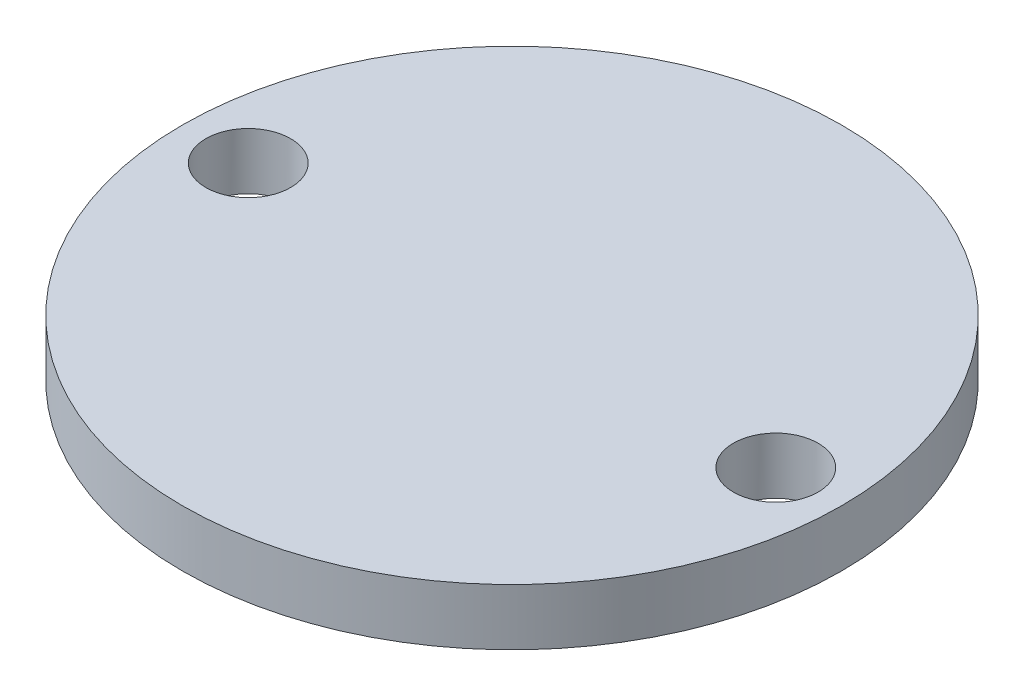
ISO-10303-21;
HEADER;
FILE_DESCRIPTION(('STEP AP214'),'2;1');
FILE_NAME('part.step','',(''),(''),'','','');
FILE_SCHEMA(('AUTOMOTIVE_DESIGN { 1 0 10303 214 1 1 1 1 }'));
ENDSEC;
DATA;
#1=APPLICATION_CONTEXT('core data for automotive mechanical design processes');
#2=APPLICATION_PROTOCOL_DEFINITION('international standard','automotive_design',2000,#1);
#3=PRODUCT_CONTEXT('',#1,'mechanical');
#4=PRODUCT('Part','Part','',(#3));
#5=PRODUCT_RELATED_PRODUCT_CATEGORY('part','',(#4));
#6=PRODUCT_DEFINITION_FORMATION('','',#4);
#7=PRODUCT_DEFINITION_CONTEXT('part definition',#1,'design');
#8=PRODUCT_DEFINITION('design','',#6,#7);
#9=PRODUCT_DEFINITION_SHAPE('','',#8);
#10=(LENGTH_UNIT() NAMED_UNIT(*) SI_UNIT(.MILLI.,.METRE.));
#11=(NAMED_UNIT(*) PLANE_ANGLE_UNIT() SI_UNIT($,.RADIAN.));
#12=(NAMED_UNIT(*) SI_UNIT($,.STERADIAN.) SOLID_ANGLE_UNIT());
#13=UNCERTAINTY_MEASURE_WITH_UNIT(LENGTH_MEASURE(1.E-05),#10,'distance_accuracy_value','');
#14=(GEOMETRIC_REPRESENTATION_CONTEXT(3) GLOBAL_UNCERTAINTY_ASSIGNED_CONTEXT((#13)) GLOBAL_UNIT_ASSIGNED_CONTEXT((#10,
#11,#12)) REPRESENTATION_CONTEXT('',''));
#15=CARTESIAN_POINT('',(0.,0.,0.));
#16=DIRECTION('',(0.,0.,1.));
#17=DIRECTION('',(1.,0.,0.));
#18=AXIS2_PLACEMENT_3D('',#15,#16,#17);
#19=CARTESIAN_POINT('',(0.,-6.9375,0.));
#20=DIRECTION('',(0.,1.,0.));
#21=DIRECTION('',(1.,0.,0.));
#22=AXIS2_PLACEMENT_3D('',#19,#20,#21);
#23=SPHERICAL_SURFACE('',#22,6.0625);
#24=CARTESIAN_POINT('',(0.,-11.,0.));
#25=DIRECTION('',(0.,1.,0.));
#26=DIRECTION('',(0.,0.,1.));
#27=AXIS2_PLACEMENT_3D('',#24,#25,#26);
#28=CIRCLE('',#27,4.5);
#29=CARTESIAN_POINT('',(0.,-11.,4.5));
#30=VERTEX_POINT('',#29);
#31=EDGE_CURVE('E10',#30,#30,#28,.T.);
#32=ORIENTED_EDGE('',*,*,#31,.F.);
#33=EDGE_LOOP('',(#32));
#34=FACE_BOUND('',#33,.T.);
#35=ADVANCED_FACE('F43',(#34),#23,.T.);
#36=CARTESIAN_POINT('',(0.,-0.167805673844981,0.));
#37=DIRECTION('',(0.,1.,0.));
#38=DIRECTION('',(0.,0.,1.));
#39=AXIS2_PLACEMENT_3D('',#36,#37,#38);
#40=DEGENERATE_TOROIDAL_SURFACE('',#39,2.68773720168002,13.,.F.);
#41=CARTESIAN_POINT('',(0.,-3.,0.));
#42=DIRECTION('',(0.,1.,0.));
#43=DIRECTION('',(0.,0.,1.));
#44=AXIS2_PLACEMENT_3D('',#41,#42,#43);
#45=CIRCLE('',#44,10.);
#46=CARTESIAN_POINT('',(0.,-3.,10.));
#47=VERTEX_POINT('',#46);
#48=EDGE_CURVE('E49',#47,#47,#45,.T.);
#49=ORIENTED_EDGE('',*,*,#48,.F.);
#50=EDGE_LOOP('',(#49));
#51=FACE_BOUND('',#50,.T.);
#52=ORIENTED_EDGE('',*,*,#31,.T.);
#53=EDGE_LOOP('',(#52));
#54=FACE_BOUND('',#53,.T.);
#55=ADVANCED_FACE('F95',(#51,#54),#40,.F.);
#56=CARTESIAN_POINT('',(0.,-3.,0.));
#57=DIRECTION('',(0.,-1.,0.));
#58=DIRECTION('',(0.,0.,-1.));
#59=AXIS2_PLACEMENT_3D('',#56,#57,#58);
#60=PLANE('',#59);
#61=CARTESIAN_POINT('',(14.,-3.,0.));
#62=DIRECTION('',(0.,-1.,0.));
#63=DIRECTION('',(0.,0.,-1.));
#64=AXIS2_PLACEMENT_3D('',#61,#62,#63);
#65=CIRCLE('',#64,2.25);
#66=CARTESIAN_POINT('',(14.,-3.,-2.25));
#67=VERTEX_POINT('',#66);
#68=EDGE_CURVE('E62',#67,#67,#65,.T.);
#69=ORIENTED_EDGE('',*,*,#68,.F.);
#70=EDGE_LOOP('',(#69));
#71=FACE_BOUND('',#70,.T.);
#72=CARTESIAN_POINT('',(-14.,-3.,0.));
#73=DIRECTION('',(0.,-1.,0.));
#74=DIRECTION('',(0.,0.,-1.));
#75=AXIS2_PLACEMENT_3D('',#72,#73,#74);
#76=CIRCLE('',#75,2.25);
#77=CARTESIAN_POINT('',(-14.,-3.,-2.25));
#78=VERTEX_POINT('',#77);
#79=EDGE_CURVE('E65',#78,#78,#76,.T.);
#80=ORIENTED_EDGE('',*,*,#79,.F.);
#81=EDGE_LOOP('',(#80));
#82=FACE_BOUND('',#81,.T.);
#83=ORIENTED_EDGE('',*,*,#48,.T.);
#84=EDGE_LOOP('',(#83));
#85=FACE_BOUND('',#84,.T.);
#86=CARTESIAN_POINT('',(0.,-3.,0.));
#87=DIRECTION('',(0.,1.,0.));
#88=DIRECTION('',(0.,0.,1.));
#89=AXIS2_PLACEMENT_3D('',#86,#87,#88);
#90=CIRCLE('',#89,17.5);
#91=CARTESIAN_POINT('',(0.,-3.,17.5));
#92=VERTEX_POINT('',#91);
#93=EDGE_CURVE('E53',#92,#92,#90,.T.);
#94=ORIENTED_EDGE('',*,*,#93,.F.);
#95=EDGE_LOOP('',(#94));
#96=FACE_BOUND('',#95,.T.);
#97=ADVANCED_FACE('F88',(#71,#82,#85,#96),#60,.T.);
#98=CARTESIAN_POINT('',(0.,0.,0.));
#99=DIRECTION('',(0.,1.,0.));
#100=DIRECTION('',(0.,0.,1.));
#101=AXIS2_PLACEMENT_3D('',#98,#99,#100);
#102=CYLINDRICAL_SURFACE('',#101,17.5);
#103=ORIENTED_EDGE('',*,*,#93,.T.);
#104=EDGE_LOOP('',(#103));
#105=FACE_BOUND('',#104,.T.);
#106=CARTESIAN_POINT('',(0.,0.,0.));
#107=DIRECTION('',(0.,1.,0.));
#108=DIRECTION('',(0.,0.,1.));
#109=AXIS2_PLACEMENT_3D('',#106,#107,#108);
#110=CIRCLE('',#109,17.5);
#111=CARTESIAN_POINT('',(0.,0.,17.5));
#112=VERTEX_POINT('',#111);
#113=EDGE_CURVE('E57',#112,#112,#110,.T.);
#114=ORIENTED_EDGE('',*,*,#113,.F.);
#115=EDGE_LOOP('',(#114));
#116=FACE_BOUND('',#115,.T.);
#117=ADVANCED_FACE('F81',(#105,#116),#102,.T.);
#118=CARTESIAN_POINT('',(0.,0.,0.));
#119=DIRECTION('',(0.,1.,0.));
#120=DIRECTION('',(0.,0.,1.));
#121=AXIS2_PLACEMENT_3D('',#118,#119,#120);
#122=PLANE('',#121);
#123=CARTESIAN_POINT('',(14.,0.,0.));
#124=DIRECTION('',(0.,1.,0.));
#125=DIRECTION('',(0.,0.,1.));
#126=AXIS2_PLACEMENT_3D('',#123,#124,#125);
#127=CIRCLE('',#126,2.25);
#128=CARTESIAN_POINT('',(14.,0.,2.25));
#129=VERTEX_POINT('',#128);
#130=EDGE_CURVE('E68',#129,#129,#127,.T.);
#131=ORIENTED_EDGE('',*,*,#130,.F.);
#132=EDGE_LOOP('',(#131));
#133=FACE_BOUND('',#132,.T.);
#134=CARTESIAN_POINT('',(-14.,0.,0.));
#135=DIRECTION('',(0.,1.,0.));
#136=DIRECTION('',(0.,0.,1.));
#137=AXIS2_PLACEMENT_3D('',#134,#135,#136);
#138=CIRCLE('',#137,2.25);
#139=CARTESIAN_POINT('',(-14.,0.,2.25));
#140=VERTEX_POINT('',#139);
#141=EDGE_CURVE('E69',#140,#140,#138,.T.);
#142=ORIENTED_EDGE('',*,*,#141,.F.);
#143=EDGE_LOOP('',(#142));
#144=FACE_BOUND('',#143,.T.);
#145=ORIENTED_EDGE('',*,*,#113,.T.);
#146=EDGE_LOOP('',(#145));
#147=FACE_BOUND('',#146,.T.);
#148=ADVANCED_FACE('F77',(#133,#144,#147),#122,.T.);
#149=CARTESIAN_POINT('',(-14.,-13.,0.));
#150=DIRECTION('',(0.,1.,0.));
#151=DIRECTION('',(0.,0.,1.));
#152=AXIS2_PLACEMENT_3D('',#149,#150,#151);
#153=CYLINDRICAL_SURFACE('',#152,2.25);
#154=ORIENTED_EDGE('',*,*,#79,.T.);
#155=EDGE_LOOP('',(#154));
#156=FACE_BOUND('',#155,.T.);
#157=ORIENTED_EDGE('',*,*,#141,.T.);
#158=EDGE_LOOP('',(#157));
#159=FACE_BOUND('',#158,.T.);
#160=ADVANCED_FACE('F80',(#156,#159),#153,.F.);
#161=CARTESIAN_POINT('',(14.,-13.,0.));
#162=DIRECTION('',(0.,1.,0.));
#163=DIRECTION('',(0.,0.,1.));
#164=AXIS2_PLACEMENT_3D('',#161,#162,#163);
#165=CYLINDRICAL_SURFACE('',#164,2.25);
#166=ORIENTED_EDGE('',*,*,#68,.T.);
#167=EDGE_LOOP('',(#166));
#168=FACE_BOUND('',#167,.T.);
#169=ORIENTED_EDGE('',*,*,#130,.T.);
#170=EDGE_LOOP('',(#169));
#171=FACE_BOUND('',#170,.T.);
#172=ADVANCED_FACE('F75',(#168,#171),#165,.F.);
#173=CLOSED_SHELL('',(#35,#55,#97,#117,#148,#160,#172));
#174=MANIFOLD_SOLID_BREP('B2',#173);
#175=ADVANCED_BREP_SHAPE_REPRESENTATION('',(#18,#174),#14);
#176=SHAPE_DEFINITION_REPRESENTATION(#9,#175);
ENDSEC;
END-ISO-10303-21;
